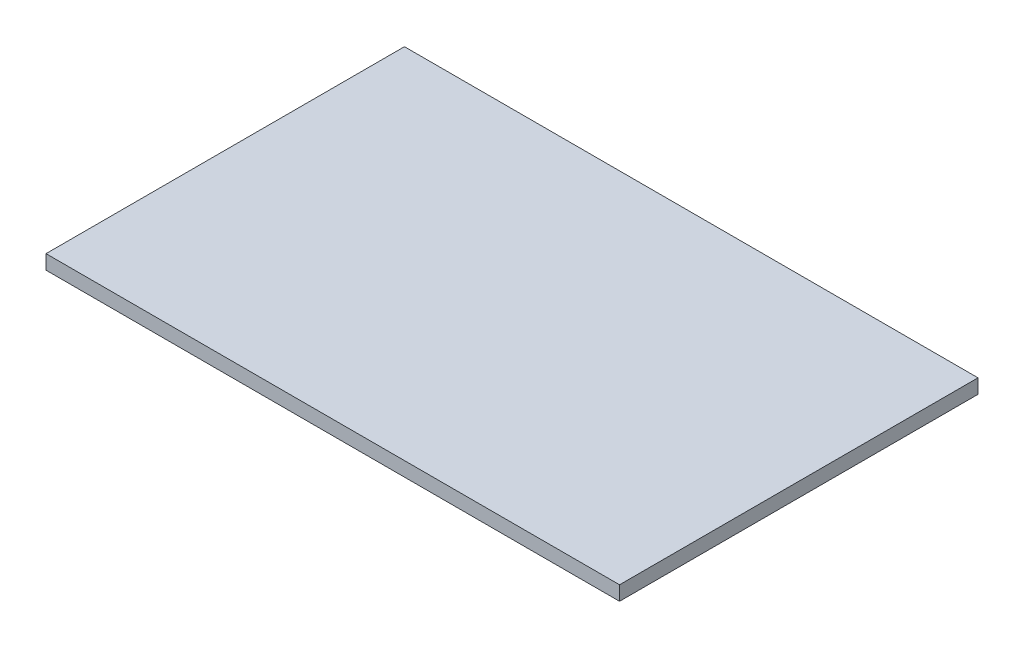
ISO-10303-21;
HEADER;
FILE_DESCRIPTION(('STEP AP214'),'2;1');
FILE_NAME('part.step','',(''),(''),'','','');
FILE_SCHEMA(('AUTOMOTIVE_DESIGN { 1 0 10303 214 1 1 1 1 }'));
ENDSEC;
DATA;
#1=APPLICATION_CONTEXT('core data for automotive mechanical design processes');
#2=APPLICATION_PROTOCOL_DEFINITION('international standard','automotive_design',2000,#1);
#3=PRODUCT_CONTEXT('',#1,'mechanical');
#4=PRODUCT('Part','Part','',(#3));
#5=PRODUCT_RELATED_PRODUCT_CATEGORY('part','',(#4));
#6=PRODUCT_DEFINITION_FORMATION('','',#4);
#7=PRODUCT_DEFINITION_CONTEXT('part definition',#1,'design');
#8=PRODUCT_DEFINITION('design','',#6,#7);
#9=PRODUCT_DEFINITION_SHAPE('','',#8);
#10=(LENGTH_UNIT() NAMED_UNIT(*) SI_UNIT(.MILLI.,.METRE.));
#11=(NAMED_UNIT(*) PLANE_ANGLE_UNIT() SI_UNIT($,.RADIAN.));
#12=(NAMED_UNIT(*) SI_UNIT($,.STERADIAN.) SOLID_ANGLE_UNIT());
#13=UNCERTAINTY_MEASURE_WITH_UNIT(LENGTH_MEASURE(1.E-05),#10,'distance_accuracy_value','');
#14=(GEOMETRIC_REPRESENTATION_CONTEXT(3) GLOBAL_UNCERTAINTY_ASSIGNED_CONTEXT((#13)) GLOBAL_UNIT_ASSIGNED_CONTEXT((#10,
#11,#12)) REPRESENTATION_CONTEXT('',''));
#15=CARTESIAN_POINT('',(0.,0.,0.));
#16=DIRECTION('',(0.,0.,1.));
#17=DIRECTION('',(1.,0.,0.));
#18=AXIS2_PLACEMENT_3D('',#15,#16,#17);
#19=CARTESIAN_POINT('',(200.,10.,-125.));
#20=DIRECTION('',(-1.,0.,0.));
#21=DIRECTION('',(0.,0.,1.));
#22=AXIS2_PLACEMENT_3D('',#19,#20,#21);
#23=PLANE('',#22);
#24=DIRECTION('',(0.,0.,-1.));
#25=VECTOR('',#24,1.);
#26=CARTESIAN_POINT('',(200.,0.,-125.));
#27=LINE('',#26,#25);
#28=CARTESIAN_POINT('',(200.,0.,125.));
#29=VERTEX_POINT('',#28);
#30=CARTESIAN_POINT('',(200.,0.,-125.));
#31=VERTEX_POINT('',#30);
#32=EDGE_CURVE('E96',#29,#31,#27,.T.);
#33=ORIENTED_EDGE('',*,*,#32,.T.);
#34=DIRECTION('',(0.,-1.,0.));
#35=VECTOR('',#34,1.);
#36=CARTESIAN_POINT('',(200.,10.,-125.));
#37=LINE('',#36,#35);
#38=CARTESIAN_POINT('',(200.,10.,-125.));
#39=VERTEX_POINT('',#38);
#40=EDGE_CURVE('E11',#39,#31,#37,.T.);
#41=ORIENTED_EDGE('',*,*,#40,.F.);
#42=DIRECTION('',(0.,0.,-1.));
#43=VECTOR('',#42,1.);
#44=CARTESIAN_POINT('',(200.,10.,-125.));
#45=LINE('',#44,#43);
#46=CARTESIAN_POINT('',(200.,10.,125.));
#47=VERTEX_POINT('',#46);
#48=EDGE_CURVE('E84',#47,#39,#45,.T.);
#49=ORIENTED_EDGE('',*,*,#48,.F.);
#50=DIRECTION('',(0.,-1.,0.));
#51=VECTOR('',#50,1.);
#52=CARTESIAN_POINT('',(200.,10.,125.));
#53=LINE('',#52,#51);
#54=EDGE_CURVE('E92',#47,#29,#53,.T.);
#55=ORIENTED_EDGE('',*,*,#54,.T.);
#56=EDGE_LOOP('',(#33,#41,#49,#55));
#57=FACE_BOUND('',#56,.T.);
#58=ADVANCED_FACE('F33',(#57),#23,.F.);
#59=CARTESIAN_POINT('',(-200.,10.,-125.));
#60=DIRECTION('',(0.,0.,1.));
#61=DIRECTION('',(1.,0.,0.));
#62=AXIS2_PLACEMENT_3D('',#59,#60,#61);
#63=PLANE('',#62);
#64=DIRECTION('',(-1.,0.,0.));
#65=VECTOR('',#64,1.);
#66=CARTESIAN_POINT('',(-200.,0.,-125.));
#67=LINE('',#66,#65);
#68=CARTESIAN_POINT('',(-200.,0.,-125.));
#69=VERTEX_POINT('',#68);
#70=EDGE_CURVE('E88',#31,#69,#67,.T.);
#71=ORIENTED_EDGE('',*,*,#70,.T.);
#72=DIRECTION('',(0.,-1.,0.));
#73=VECTOR('',#72,1.);
#74=CARTESIAN_POINT('',(-200.,10.,-125.));
#75=LINE('',#74,#73);
#76=CARTESIAN_POINT('',(-200.,10.,-125.));
#77=VERTEX_POINT('',#76);
#78=EDGE_CURVE('E41',#77,#69,#75,.T.);
#79=ORIENTED_EDGE('',*,*,#78,.F.);
#80=DIRECTION('',(-1.,0.,0.));
#81=VECTOR('',#80,1.);
#82=CARTESIAN_POINT('',(-200.,10.,-125.));
#83=LINE('',#82,#81);
#84=EDGE_CURVE('E79',#39,#77,#83,.T.);
#85=ORIENTED_EDGE('',*,*,#84,.F.);
#86=ORIENTED_EDGE('',*,*,#40,.T.);
#87=EDGE_LOOP('',(#71,#79,#85,#86));
#88=FACE_BOUND('',#87,.T.);
#89=ADVANCED_FACE('F87',(#88),#63,.F.);
#90=CARTESIAN_POINT('',(-200.,10.,-125.));
#91=DIRECTION('',(1.,0.,0.));
#92=DIRECTION('',(0.,0.,-1.));
#93=AXIS2_PLACEMENT_3D('',#90,#91,#92);
#94=PLANE('',#93);
#95=DIRECTION('',(0.,0.,1.));
#96=VECTOR('',#95,1.);
#97=CARTESIAN_POINT('',(-200.,0.,-125.));
#98=LINE('',#97,#96);
#99=CARTESIAN_POINT('',(-200.,0.,125.));
#100=VERTEX_POINT('',#99);
#101=EDGE_CURVE('E66',#69,#100,#98,.T.);
#102=ORIENTED_EDGE('',*,*,#101,.T.);
#103=DIRECTION('',(0.,-1.,0.));
#104=VECTOR('',#103,1.);
#105=CARTESIAN_POINT('',(-200.,10.,125.));
#106=LINE('',#105,#104);
#107=CARTESIAN_POINT('',(-200.,10.,125.));
#108=VERTEX_POINT('',#107);
#109=EDGE_CURVE('E89',#108,#100,#106,.T.);
#110=ORIENTED_EDGE('',*,*,#109,.F.);
#111=DIRECTION('',(0.,0.,1.));
#112=VECTOR('',#111,1.);
#113=CARTESIAN_POINT('',(-200.,10.,-125.));
#114=LINE('',#113,#112);
#115=EDGE_CURVE('E82',#77,#108,#114,.T.);
#116=ORIENTED_EDGE('',*,*,#115,.F.);
#117=ORIENTED_EDGE('',*,*,#78,.T.);
#118=EDGE_LOOP('',(#102,#110,#116,#117));
#119=FACE_BOUND('',#118,.T.);
#120=ADVANCED_FACE('F90',(#119),#94,.F.);
#121=CARTESIAN_POINT('',(-200.,10.,125.));
#122=DIRECTION('',(0.,0.,-1.));
#123=DIRECTION('',(-1.,0.,0.));
#124=AXIS2_PLACEMENT_3D('',#121,#122,#123);
#125=PLANE('',#124);
#126=DIRECTION('',(1.,0.,0.));
#127=VECTOR('',#126,1.);
#128=CARTESIAN_POINT('',(-200.,0.,125.));
#129=LINE('',#128,#127);
#130=EDGE_CURVE('E72',#100,#29,#129,.T.);
#131=ORIENTED_EDGE('',*,*,#130,.T.);
#132=ORIENTED_EDGE('',*,*,#54,.F.);
#133=DIRECTION('',(1.,0.,0.));
#134=VECTOR('',#133,1.);
#135=CARTESIAN_POINT('',(-200.,10.,125.));
#136=LINE('',#135,#134);
#137=EDGE_CURVE('E49',#108,#47,#136,.T.);
#138=ORIENTED_EDGE('',*,*,#137,.F.);
#139=ORIENTED_EDGE('',*,*,#109,.T.);
#140=EDGE_LOOP('',(#131,#132,#138,#139));
#141=FACE_BOUND('',#140,.T.);
#142=ADVANCED_FACE('F103',(#141),#125,.F.);
#143=CARTESIAN_POINT('',(0.,10.,0.));
#144=DIRECTION('',(0.,1.,0.));
#145=DIRECTION('',(0.,0.,1.));
#146=AXIS2_PLACEMENT_3D('',#143,#144,#145);
#147=PLANE('',#146);
#148=ORIENTED_EDGE('',*,*,#48,.T.);
#149=ORIENTED_EDGE('',*,*,#84,.T.);
#150=ORIENTED_EDGE('',*,*,#115,.T.);
#151=ORIENTED_EDGE('',*,*,#137,.T.);
#152=EDGE_LOOP('',(#148,#149,#150,#151));
#153=FACE_BOUND('',#152,.T.);
#154=ADVANCED_FACE('F80',(#153),#147,.T.);
#155=CARTESIAN_POINT('',(0.,0.,0.));
#156=DIRECTION('',(0.,1.,0.));
#157=DIRECTION('',(0.,0.,1.));
#158=AXIS2_PLACEMENT_3D('',#155,#156,#157);
#159=PLANE('',#158);
#160=ORIENTED_EDGE('',*,*,#32,.F.);
#161=ORIENTED_EDGE('',*,*,#130,.F.);
#162=ORIENTED_EDGE('',*,*,#101,.F.);
#163=ORIENTED_EDGE('',*,*,#70,.F.);
#164=EDGE_LOOP('',(#160,#161,#162,#163));
#165=FACE_BOUND('',#164,.T.);
#166=ADVANCED_FACE('F106',(#165),#159,.F.);
#167=CLOSED_SHELL('',(#58,#89,#120,#142,#154,#166));
#168=MANIFOLD_SOLID_BREP('B2',#167);
#169=ADVANCED_BREP_SHAPE_REPRESENTATION('',(#18,#168),#14);
#170=SHAPE_DEFINITION_REPRESENTATION(#9,#169);
ENDSEC;
END-ISO-10303-21;
